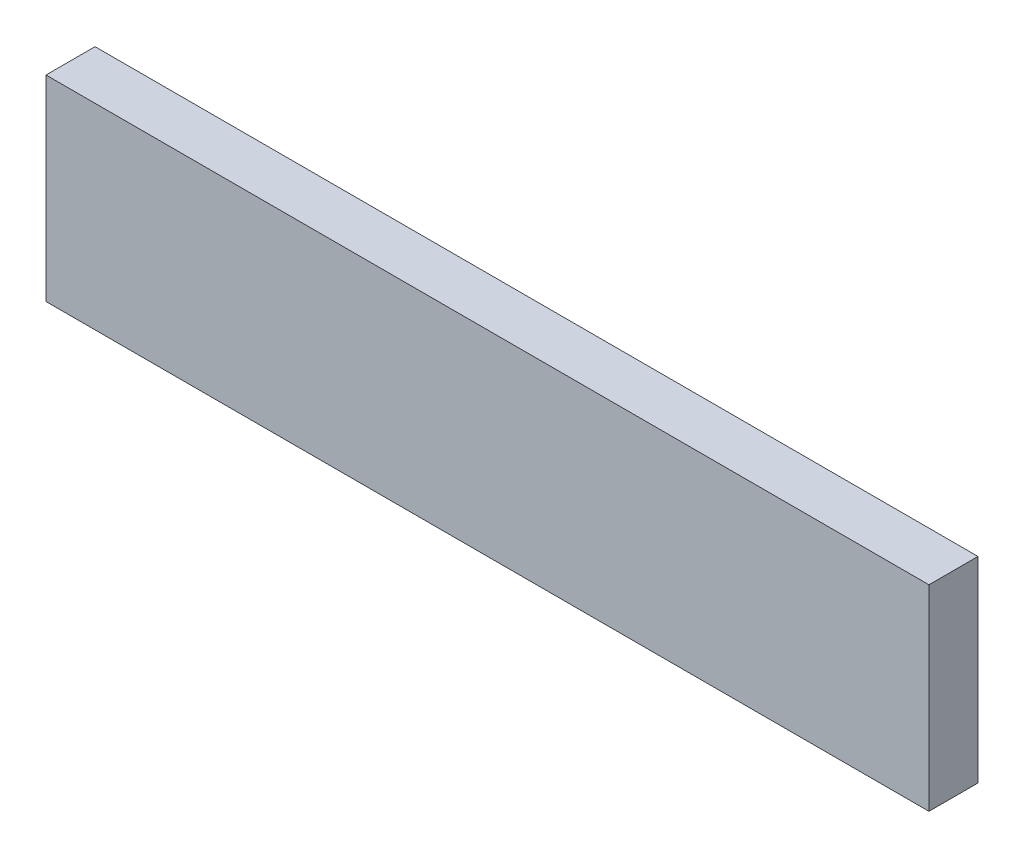
ISO-10303-21;
HEADER;
FILE_DESCRIPTION(('STEP AP214'),'2;1');
FILE_NAME('part.step','',(''),(''),'','','');
FILE_SCHEMA(('AUTOMOTIVE_DESIGN { 1 0 10303 214 1 1 1 1 }'));
ENDSEC;
DATA;
#1=APPLICATION_CONTEXT('core data for automotive mechanical design processes');
#2=APPLICATION_PROTOCOL_DEFINITION('international standard','automotive_design',2000,#1);
#3=PRODUCT_CONTEXT('',#1,'mechanical');
#4=PRODUCT('Part','Part','',(#3));
#5=PRODUCT_RELATED_PRODUCT_CATEGORY('part','',(#4));
#6=PRODUCT_DEFINITION_FORMATION('','',#4);
#7=PRODUCT_DEFINITION_CONTEXT('part definition',#1,'design');
#8=PRODUCT_DEFINITION('design','',#6,#7);
#9=PRODUCT_DEFINITION_SHAPE('','',#8);
#10=(LENGTH_UNIT() NAMED_UNIT(*) SI_UNIT(.MILLI.,.METRE.));
#11=(NAMED_UNIT(*) PLANE_ANGLE_UNIT() SI_UNIT($,.RADIAN.));
#12=(NAMED_UNIT(*) SI_UNIT($,.STERADIAN.) SOLID_ANGLE_UNIT());
#13=UNCERTAINTY_MEASURE_WITH_UNIT(LENGTH_MEASURE(1.E-05),#10,'distance_accuracy_value','');
#14=(GEOMETRIC_REPRESENTATION_CONTEXT(3) GLOBAL_UNCERTAINTY_ASSIGNED_CONTEXT((#13)) GLOBAL_UNIT_ASSIGNED_CONTEXT((#10,
#11,#12)) REPRESENTATION_CONTEXT('',''));
#15=CARTESIAN_POINT('',(0.,0.,0.));
#16=DIRECTION('',(0.,0.,1.));
#17=DIRECTION('',(1.,0.,0.));
#18=AXIS2_PLACEMENT_3D('',#15,#16,#17);
#19=CARTESIAN_POINT('',(0.,0.,5.));
#20=DIRECTION('',(-1.,0.,0.));
#21=DIRECTION('',(0.,0.,1.));
#22=AXIS2_PLACEMENT_3D('',#19,#20,#21);
#23=PLANE('',#22);
#24=DIRECTION('',(0.,1.,0.));
#25=VECTOR('',#24,1.);
#26=CARTESIAN_POINT('',(0.,0.,0.));
#27=LINE('',#26,#25);
#28=CARTESIAN_POINT('',(0.,0.,0.));
#29=VERTEX_POINT('',#28);
#30=CARTESIAN_POINT('',(0.,20.,0.));
#31=VERTEX_POINT('',#30);
#32=EDGE_CURVE('E96',#29,#31,#27,.T.);
#33=ORIENTED_EDGE('',*,*,#32,.T.);
#34=DIRECTION('',(0.,0.,-1.));
#35=VECTOR('',#34,1.);
#36=CARTESIAN_POINT('',(0.,20.,5.));
#37=LINE('',#36,#35);
#38=CARTESIAN_POINT('',(0.,20.,5.));
#39=VERTEX_POINT('',#38);
#40=EDGE_CURVE('E11',#39,#31,#37,.T.);
#41=ORIENTED_EDGE('',*,*,#40,.F.);
#42=DIRECTION('',(0.,1.,0.));
#43=VECTOR('',#42,1.);
#44=CARTESIAN_POINT('',(0.,0.,5.));
#45=LINE('',#44,#43);
#46=CARTESIAN_POINT('',(0.,0.,5.));
#47=VERTEX_POINT('',#46);
#48=EDGE_CURVE('E84',#47,#39,#45,.T.);
#49=ORIENTED_EDGE('',*,*,#48,.F.);
#50=DIRECTION('',(0.,0.,-1.));
#51=VECTOR('',#50,1.);
#52=CARTESIAN_POINT('',(0.,0.,5.));
#53=LINE('',#52,#51);
#54=EDGE_CURVE('E92',#47,#29,#53,.T.);
#55=ORIENTED_EDGE('',*,*,#54,.T.);
#56=EDGE_LOOP('',(#33,#41,#49,#55));
#57=FACE_BOUND('',#56,.T.);
#58=ADVANCED_FACE('F33',(#57),#23,.F.);
#59=CARTESIAN_POINT('',(0.,20.,5.));
#60=DIRECTION('',(0.,-1.,0.));
#61=DIRECTION('',(1.,0.,0.));
#62=AXIS2_PLACEMENT_3D('',#59,#60,#61);
#63=PLANE('',#62);
#64=DIRECTION('',(-1.,0.,0.));
#65=VECTOR('',#64,1.);
#66=CARTESIAN_POINT('',(0.,20.,0.));
#67=LINE('',#66,#65);
#68=CARTESIAN_POINT('',(-90.,20.,0.));
#69=VERTEX_POINT('',#68);
#70=EDGE_CURVE('E88',#31,#69,#67,.T.);
#71=ORIENTED_EDGE('',*,*,#70,.T.);
#72=DIRECTION('',(0.,0.,-1.));
#73=VECTOR('',#72,1.);
#74=CARTESIAN_POINT('',(-90.,20.,5.));
#75=LINE('',#74,#73);
#76=CARTESIAN_POINT('',(-90.,20.,5.));
#77=VERTEX_POINT('',#76);
#78=EDGE_CURVE('E41',#77,#69,#75,.T.);
#79=ORIENTED_EDGE('',*,*,#78,.F.);
#80=DIRECTION('',(-1.,0.,0.));
#81=VECTOR('',#80,1.);
#82=CARTESIAN_POINT('',(0.,20.,5.));
#83=LINE('',#82,#81);
#84=EDGE_CURVE('E79',#39,#77,#83,.T.);
#85=ORIENTED_EDGE('',*,*,#84,.F.);
#86=ORIENTED_EDGE('',*,*,#40,.T.);
#87=EDGE_LOOP('',(#71,#79,#85,#86));
#88=FACE_BOUND('',#87,.T.);
#89=ADVANCED_FACE('F87',(#88),#63,.F.);
#90=CARTESIAN_POINT('',(-90.,0.,5.));
#91=DIRECTION('',(1.,0.,0.));
#92=DIRECTION('',(0.,0.,-1.));
#93=AXIS2_PLACEMENT_3D('',#90,#91,#92);
#94=PLANE('',#93);
#95=DIRECTION('',(0.,-1.,0.));
#96=VECTOR('',#95,1.);
#97=CARTESIAN_POINT('',(-90.,0.,0.));
#98=LINE('',#97,#96);
#99=CARTESIAN_POINT('',(-90.,0.,0.));
#100=VERTEX_POINT('',#99);
#101=EDGE_CURVE('E66',#69,#100,#98,.T.);
#102=ORIENTED_EDGE('',*,*,#101,.T.);
#103=DIRECTION('',(0.,0.,-1.));
#104=VECTOR('',#103,1.);
#105=CARTESIAN_POINT('',(-90.,0.,5.));
#106=LINE('',#105,#104);
#107=CARTESIAN_POINT('',(-90.,0.,5.));
#108=VERTEX_POINT('',#107);
#109=EDGE_CURVE('E89',#108,#100,#106,.T.);
#110=ORIENTED_EDGE('',*,*,#109,.F.);
#111=DIRECTION('',(0.,-1.,0.));
#112=VECTOR('',#111,1.);
#113=CARTESIAN_POINT('',(-90.,0.,5.));
#114=LINE('',#113,#112);
#115=EDGE_CURVE('E82',#77,#108,#114,.T.);
#116=ORIENTED_EDGE('',*,*,#115,.F.);
#117=ORIENTED_EDGE('',*,*,#78,.T.);
#118=EDGE_LOOP('',(#102,#110,#116,#117));
#119=FACE_BOUND('',#118,.T.);
#120=ADVANCED_FACE('F90',(#119),#94,.F.);
#121=CARTESIAN_POINT('',(0.,0.,5.));
#122=DIRECTION('',(0.,1.,0.));
#123=DIRECTION('',(-1.,0.,0.));
#124=AXIS2_PLACEMENT_3D('',#121,#122,#123);
#125=PLANE('',#124);
#126=DIRECTION('',(1.,0.,0.));
#127=VECTOR('',#126,1.);
#128=CARTESIAN_POINT('',(0.,0.,0.));
#129=LINE('',#128,#127);
#130=EDGE_CURVE('E72',#100,#29,#129,.T.);
#131=ORIENTED_EDGE('',*,*,#130,.T.);
#132=ORIENTED_EDGE('',*,*,#54,.F.);
#133=DIRECTION('',(1.,0.,0.));
#134=VECTOR('',#133,1.);
#135=CARTESIAN_POINT('',(0.,0.,5.));
#136=LINE('',#135,#134);
#137=EDGE_CURVE('E49',#108,#47,#136,.T.);
#138=ORIENTED_EDGE('',*,*,#137,.F.);
#139=ORIENTED_EDGE('',*,*,#109,.T.);
#140=EDGE_LOOP('',(#131,#132,#138,#139));
#141=FACE_BOUND('',#140,.T.);
#142=ADVANCED_FACE('F103',(#141),#125,.F.);
#143=CARTESIAN_POINT('',(0.,0.,5.));
#144=DIRECTION('',(0.,0.,1.));
#145=DIRECTION('',(1.,0.,0.));
#146=AXIS2_PLACEMENT_3D('',#143,#144,#145);
#147=PLANE('',#146);
#148=ORIENTED_EDGE('',*,*,#48,.T.);
#149=ORIENTED_EDGE('',*,*,#84,.T.);
#150=ORIENTED_EDGE('',*,*,#115,.T.);
#151=ORIENTED_EDGE('',*,*,#137,.T.);
#152=EDGE_LOOP('',(#148,#149,#150,#151));
#153=FACE_BOUND('',#152,.T.);
#154=ADVANCED_FACE('F80',(#153),#147,.T.);
#155=CARTESIAN_POINT('',(0.,0.,0.));
#156=DIRECTION('',(0.,0.,1.));
#157=DIRECTION('',(1.,0.,0.));
#158=AXIS2_PLACEMENT_3D('',#155,#156,#157);
#159=PLANE('',#158);
#160=ORIENTED_EDGE('',*,*,#32,.F.);
#161=ORIENTED_EDGE('',*,*,#130,.F.);
#162=ORIENTED_EDGE('',*,*,#101,.F.);
#163=ORIENTED_EDGE('',*,*,#70,.F.);
#164=EDGE_LOOP('',(#160,#161,#162,#163));
#165=FACE_BOUND('',#164,.T.);
#166=ADVANCED_FACE('F106',(#165),#159,.F.);
#167=CLOSED_SHELL('',(#58,#89,#120,#142,#154,#166));
#168=MANIFOLD_SOLID_BREP('B2',#167);
#169=ADVANCED_BREP_SHAPE_REPRESENTATION('',(#18,#168),#14);
#170=SHAPE_DEFINITION_REPRESENTATION(#9,#169);
ENDSEC;
END-ISO-10303-21;
